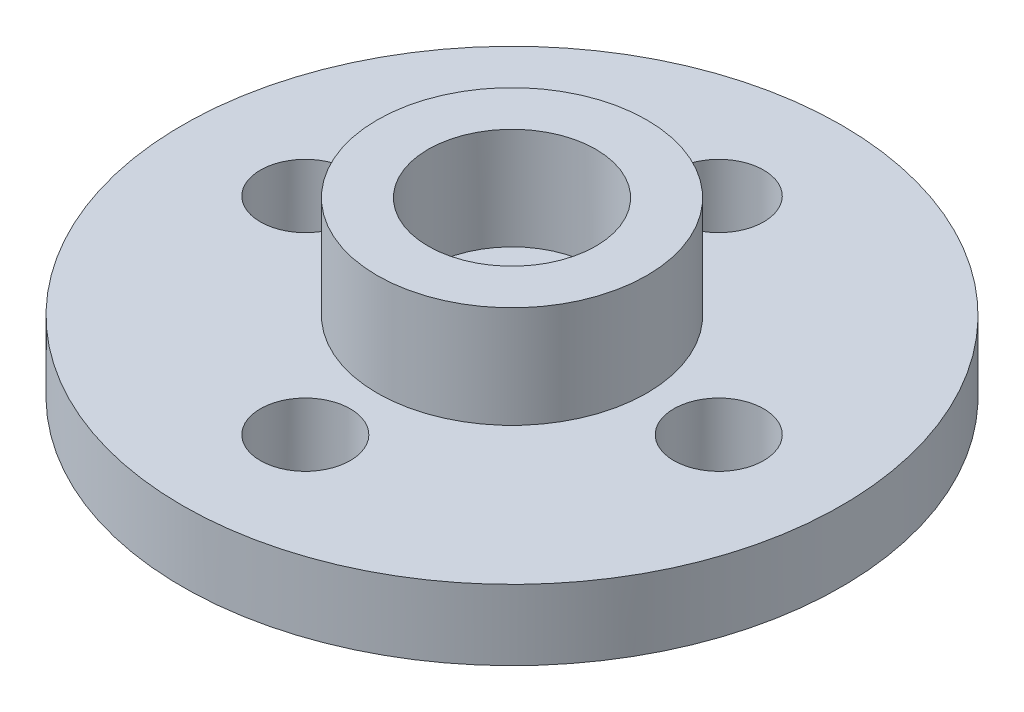
ISO-10303-21;
HEADER;
FILE_DESCRIPTION(('STEP AP214'),'2;1');
FILE_NAME('part.step','',(''),(''),'','','');
FILE_SCHEMA(('AUTOMOTIVE_DESIGN { 1 0 10303 214 1 1 1 1 }'));
ENDSEC;
DATA;
#1=APPLICATION_CONTEXT('core data for automotive mechanical design processes');
#2=APPLICATION_PROTOCOL_DEFINITION('international standard','automotive_design',2000,#1);
#3=PRODUCT_CONTEXT('',#1,'mechanical');
#4=PRODUCT('Part','Part','',(#3));
#5=PRODUCT_RELATED_PRODUCT_CATEGORY('part','',(#4));
#6=PRODUCT_DEFINITION_FORMATION('','',#4);
#7=PRODUCT_DEFINITION_CONTEXT('part definition',#1,'design');
#8=PRODUCT_DEFINITION('design','',#6,#7);
#9=PRODUCT_DEFINITION_SHAPE('','',#8);
#10=(LENGTH_UNIT() NAMED_UNIT(*) SI_UNIT(.MILLI.,.METRE.));
#11=(NAMED_UNIT(*) PLANE_ANGLE_UNIT() SI_UNIT($,.RADIAN.));
#12=(NAMED_UNIT(*) SI_UNIT($,.STERADIAN.) SOLID_ANGLE_UNIT());
#13=UNCERTAINTY_MEASURE_WITH_UNIT(LENGTH_MEASURE(1.E-05),#10,'distance_accuracy_value','');
#14=(GEOMETRIC_REPRESENTATION_CONTEXT(3) GLOBAL_UNCERTAINTY_ASSIGNED_CONTEXT((#13)) GLOBAL_UNIT_ASSIGNED_CONTEXT((#10,
#11,#12)) REPRESENTATION_CONTEXT('',''));
#15=CARTESIAN_POINT('',(0.,0.,0.));
#16=DIRECTION('',(0.,0.,1.));
#17=DIRECTION('',(1.,0.,0.));
#18=AXIS2_PLACEMENT_3D('',#15,#16,#17);
#19=CARTESIAN_POINT('',(0.,5.65,0.));
#20=DIRECTION('',(0.,-1.,0.));
#21=DIRECTION('',(0.,0.,-1.));
#22=AXIS2_PLACEMENT_3D('',#19,#20,#21);
#23=CYLINDRICAL_SURFACE('',#22,11.);
#24=CARTESIAN_POINT('',(0.,1.65,0.));
#25=DIRECTION('',(0.,1.,0.));
#26=DIRECTION('',(0.,0.,1.));
#27=AXIS2_PLACEMENT_3D('',#24,#25,#26);
#28=CIRCLE('',#27,11.);
#29=CARTESIAN_POINT('',(0.,1.65,11.));
#30=VERTEX_POINT('',#29);
#31=EDGE_CURVE('E51',#30,#30,#28,.T.);
#32=ORIENTED_EDGE('',*,*,#31,.F.);
#33=EDGE_LOOP('',(#32));
#34=FACE_BOUND('',#33,.T.);
#35=CARTESIAN_POINT('',(0.,-0.7,0.));
#36=DIRECTION('',(0.,-1.,0.));
#37=DIRECTION('',(0.,0.,-1.));
#38=AXIS2_PLACEMENT_3D('',#35,#36,#37);
#39=CIRCLE('',#38,11.);
#40=CARTESIAN_POINT('',(0.,-0.7,-11.));
#41=VERTEX_POINT('',#40);
#42=EDGE_CURVE('E76',#41,#41,#39,.T.);
#43=ORIENTED_EDGE('',*,*,#42,.F.);
#44=EDGE_LOOP('',(#43));
#45=FACE_BOUND('',#44,.T.);
#46=ADVANCED_FACE('F31',(#34,#45),#23,.T.);
#47=CARTESIAN_POINT('',(0.,-6.35000000000001,6.9));
#48=DIRECTION('',(0.,1.,0.));
#49=DIRECTION('',(0.,0.,1.));
#50=AXIS2_PLACEMENT_3D('',#47,#48,#49);
#51=CYLINDRICAL_SURFACE('',#50,1.5);
#52=CARTESIAN_POINT('',(0.,1.65,6.9));
#53=DIRECTION('',(0.,1.,0.));
#54=DIRECTION('',(0.,0.,1.));
#55=AXIS2_PLACEMENT_3D('',#52,#53,#54);
#56=CIRCLE('',#55,1.5);
#57=CARTESIAN_POINT('',(0.,1.65,8.4));
#58=VERTEX_POINT('',#57);
#59=EDGE_CURVE('E37',#58,#58,#56,.F.);
#60=ORIENTED_EDGE('',*,*,#59,.F.);
#61=EDGE_LOOP('',(#60));
#62=FACE_BOUND('',#61,.T.);
#63=CARTESIAN_POINT('',(0.,-0.7,6.9));
#64=DIRECTION('',(0.,-1.,0.));
#65=DIRECTION('',(0.,0.,-1.));
#66=AXIS2_PLACEMENT_3D('',#63,#64,#65);
#67=CIRCLE('',#66,1.5);
#68=CARTESIAN_POINT('',(0.,-0.7,5.4));
#69=VERTEX_POINT('',#68);
#70=EDGE_CURVE('E84',#69,#69,#67,.T.);
#71=ORIENTED_EDGE('',*,*,#70,.T.);
#72=EDGE_LOOP('',(#71));
#73=FACE_BOUND('',#72,.T.);
#74=ADVANCED_FACE('F114',(#62,#73),#51,.F.);
#75=CARTESIAN_POINT('',(6.9,-6.35000000000001,0.));
#76=DIRECTION('',(0.,1.,0.));
#77=DIRECTION('',(0.,0.,1.));
#78=AXIS2_PLACEMENT_3D('',#75,#76,#77);
#79=CYLINDRICAL_SURFACE('',#78,1.5);
#80=CARTESIAN_POINT('',(6.9,1.65,0.));
#81=DIRECTION('',(0.,1.,0.));
#82=DIRECTION('',(0.,0.,1.));
#83=AXIS2_PLACEMENT_3D('',#80,#81,#82);
#84=CIRCLE('',#83,1.5);
#85=CARTESIAN_POINT('',(6.9,1.65,1.5));
#86=VERTEX_POINT('',#85);
#87=EDGE_CURVE('E41',#86,#86,#84,.F.);
#88=ORIENTED_EDGE('',*,*,#87,.F.);
#89=EDGE_LOOP('',(#88));
#90=FACE_BOUND('',#89,.T.);
#91=CARTESIAN_POINT('',(6.9,-0.7,0.));
#92=DIRECTION('',(0.,-1.,0.));
#93=DIRECTION('',(0.,0.,-1.));
#94=AXIS2_PLACEMENT_3D('',#91,#92,#93);
#95=CIRCLE('',#94,1.5);
#96=CARTESIAN_POINT('',(6.9,-0.7,-1.5));
#97=VERTEX_POINT('',#96);
#98=EDGE_CURVE('E87',#97,#97,#95,.T.);
#99=ORIENTED_EDGE('',*,*,#98,.T.);
#100=EDGE_LOOP('',(#99));
#101=FACE_BOUND('',#100,.T.);
#102=ADVANCED_FACE('F119',(#90,#101),#79,.F.);
#103=CARTESIAN_POINT('',(0.,-6.35000000000001,-6.9));
#104=DIRECTION('',(0.,1.,0.));
#105=DIRECTION('',(0.,0.,1.));
#106=AXIS2_PLACEMENT_3D('',#103,#104,#105);
#107=CYLINDRICAL_SURFACE('',#106,1.5);
#108=CARTESIAN_POINT('',(0.,1.65,-6.9));
#109=DIRECTION('',(0.,1.,0.));
#110=DIRECTION('',(0.,0.,1.));
#111=AXIS2_PLACEMENT_3D('',#108,#109,#110);
#112=CIRCLE('',#111,1.5);
#113=CARTESIAN_POINT('',(0.,1.65,-5.4));
#114=VERTEX_POINT('',#113);
#115=EDGE_CURVE('E46',#114,#114,#112,.F.);
#116=ORIENTED_EDGE('',*,*,#115,.F.);
#117=EDGE_LOOP('',(#116));
#118=FACE_BOUND('',#117,.T.);
#119=CARTESIAN_POINT('',(0.,-0.7,-6.9));
#120=DIRECTION('',(0.,-1.,0.));
#121=DIRECTION('',(0.,0.,-1.));
#122=AXIS2_PLACEMENT_3D('',#119,#120,#121);
#123=CIRCLE('',#122,1.5);
#124=CARTESIAN_POINT('',(0.,-0.7,-8.4));
#125=VERTEX_POINT('',#124);
#126=EDGE_CURVE('E90',#125,#125,#123,.T.);
#127=ORIENTED_EDGE('',*,*,#126,.T.);
#128=EDGE_LOOP('',(#127));
#129=FACE_BOUND('',#128,.T.);
#130=ADVANCED_FACE('F131',(#118,#129),#107,.F.);
#131=CARTESIAN_POINT('',(-6.9,-6.35000000000001,0.));
#132=DIRECTION('',(0.,1.,0.));
#133=DIRECTION('',(0.,0.,1.));
#134=AXIS2_PLACEMENT_3D('',#131,#132,#133);
#135=CYLINDRICAL_SURFACE('',#134,1.5);
#136=CARTESIAN_POINT('',(-6.9,1.65,0.));
#137=DIRECTION('',(0.,1.,0.));
#138=DIRECTION('',(0.,0.,1.));
#139=AXIS2_PLACEMENT_3D('',#136,#137,#138);
#140=CIRCLE('',#139,1.5);
#141=CARTESIAN_POINT('',(-6.9,1.65,1.5));
#142=VERTEX_POINT('',#141);
#143=EDGE_CURVE('E49',#142,#142,#140,.F.);
#144=ORIENTED_EDGE('',*,*,#143,.F.);
#145=EDGE_LOOP('',(#144));
#146=FACE_BOUND('',#145,.T.);
#147=CARTESIAN_POINT('',(-6.9,-0.7,0.));
#148=DIRECTION('',(0.,-1.,0.));
#149=DIRECTION('',(0.,0.,-1.));
#150=AXIS2_PLACEMENT_3D('',#147,#148,#149);
#151=CIRCLE('',#150,1.5);
#152=CARTESIAN_POINT('',(-6.9,-0.7,-1.5));
#153=VERTEX_POINT('',#152);
#154=EDGE_CURVE('E93',#153,#153,#151,.T.);
#155=ORIENTED_EDGE('',*,*,#154,.T.);
#156=EDGE_LOOP('',(#155));
#157=FACE_BOUND('',#156,.T.);
#158=ADVANCED_FACE('F97',(#146,#157),#135,.F.);
#159=CARTESIAN_POINT('',(0.,-6.35000000000001,0.));
#160=DIRECTION('',(0.,1.,0.));
#161=DIRECTION('',(0.,0.,1.));
#162=AXIS2_PLACEMENT_3D('',#159,#160,#161);
#163=CYLINDRICAL_SURFACE('',#162,2.8);
#164=CARTESIAN_POINT('',(0.,1.65,0.));
#165=DIRECTION('',(0.,1.,0.));
#166=DIRECTION('',(0.,0.,1.));
#167=AXIS2_PLACEMENT_3D('',#164,#165,#166);
#168=CIRCLE('',#167,2.8);
#169=CARTESIAN_POINT('',(0.,1.65,2.8));
#170=VERTEX_POINT('',#169);
#171=EDGE_CURVE('E67',#170,#170,#168,.T.);
#172=ORIENTED_EDGE('',*,*,#171,.F.);
#173=EDGE_LOOP('',(#172));
#174=FACE_BOUND('',#173,.T.);
#175=CARTESIAN_POINT('',(0.,5.05,0.));
#176=DIRECTION('',(0.,-1.,0.));
#177=DIRECTION('',(0.,0.,-1.));
#178=AXIS2_PLACEMENT_3D('',#175,#176,#177);
#179=CIRCLE('',#178,2.8);
#180=CARTESIAN_POINT('',(0.,5.05,-2.8));
#181=VERTEX_POINT('',#180);
#182=EDGE_CURVE('E61',#181,#181,#179,.F.);
#183=ORIENTED_EDGE('',*,*,#182,.T.);
#184=EDGE_LOOP('',(#183));
#185=FACE_BOUND('',#184,.T.);
#186=ADVANCED_FACE('F145',(#174,#185),#163,.F.);
#187=CARTESIAN_POINT('',(0.,1.65,0.));
#188=DIRECTION('',(0.,1.,0.));
#189=DIRECTION('',(0.,0.,1.));
#190=AXIS2_PLACEMENT_3D('',#187,#188,#189);
#191=PLANE('',#190);
#192=CARTESIAN_POINT('',(0.,1.65,0.));
#193=DIRECTION('',(0.,1.,0.));
#194=DIRECTION('',(0.,0.,1.));
#195=AXIS2_PLACEMENT_3D('',#192,#193,#194);
#196=CIRCLE('',#195,4.5);
#197=CARTESIAN_POINT('',(0.,1.65,4.5));
#198=VERTEX_POINT('',#197);
#199=EDGE_CURVE('E56',#198,#198,#196,.T.);
#200=ORIENTED_EDGE('',*,*,#199,.F.);
#201=EDGE_LOOP('',(#200));
#202=FACE_BOUND('',#201,.T.);
#203=ORIENTED_EDGE('',*,*,#31,.T.);
#204=EDGE_LOOP('',(#203));
#205=FACE_BOUND('',#204,.T.);
#206=ORIENTED_EDGE('',*,*,#143,.T.);
#207=EDGE_LOOP('',(#206));
#208=FACE_BOUND('',#207,.T.);
#209=ORIENTED_EDGE('',*,*,#115,.T.);
#210=EDGE_LOOP('',(#209));
#211=FACE_BOUND('',#210,.T.);
#212=ORIENTED_EDGE('',*,*,#87,.T.);
#213=EDGE_LOOP('',(#212));
#214=FACE_BOUND('',#213,.T.);
#215=ORIENTED_EDGE('',*,*,#59,.T.);
#216=EDGE_LOOP('',(#215));
#217=FACE_BOUND('',#216,.T.);
#218=ADVANCED_FACE('F141',(#202,#205,#208,#211,#214,#217),#191,.T.);
#219=CARTESIAN_POINT('',(0.,1.65,0.));
#220=DIRECTION('',(0.,1.,0.));
#221=DIRECTION('',(0.,0.,1.));
#222=AXIS2_PLACEMENT_3D('',#219,#220,#221);
#223=CYLINDRICAL_SURFACE('',#222,4.5);
#224=CARTESIAN_POINT('',(0.,5.05,0.));
#225=DIRECTION('',(0.,-1.,0.));
#226=DIRECTION('',(0.,0.,-1.));
#227=AXIS2_PLACEMENT_3D('',#224,#225,#226);
#228=CIRCLE('',#227,4.5);
#229=CARTESIAN_POINT('',(0.,5.05,-4.5));
#230=VERTEX_POINT('',#229);
#231=EDGE_CURVE('E10',#230,#230,#228,.F.);
#232=ORIENTED_EDGE('',*,*,#231,.F.);
#233=EDGE_LOOP('',(#232));
#234=FACE_BOUND('',#233,.T.);
#235=ORIENTED_EDGE('',*,*,#199,.T.);
#236=EDGE_LOOP('',(#235));
#237=FACE_BOUND('',#236,.T.);
#238=ADVANCED_FACE('F152',(#234,#237),#223,.T.);
#239=CARTESIAN_POINT('',(-8.,5.05,4.5));
#240=DIRECTION('',(0.,-1.,0.));
#241=DIRECTION('',(0.,0.,-1.));
#242=AXIS2_PLACEMENT_3D('',#239,#240,#241);
#243=PLANE('',#242);
#244=ORIENTED_EDGE('',*,*,#231,.T.);
#245=EDGE_LOOP('',(#244));
#246=FACE_BOUND('',#245,.T.);
#247=ORIENTED_EDGE('',*,*,#182,.F.);
#248=EDGE_LOOP('',(#247));
#249=FACE_BOUND('',#248,.T.);
#250=ADVANCED_FACE('F158',(#246,#249),#243,.F.);
#251=CARTESIAN_POINT('',(0.,-0.650000000000003,0.));
#252=DIRECTION('',(0.,1.,0.));
#253=DIRECTION('',(0.,0.,1.));
#254=AXIS2_PLACEMENT_3D('',#251,#252,#253);
#255=PLANE('',#254);
#256=CARTESIAN_POINT('',(0.,-0.650000000000003,0.));
#257=DIRECTION('',(0.,1.,0.));
#258=DIRECTION('',(0.,0.,1.));
#259=AXIS2_PLACEMENT_3D('',#256,#257,#258);
#260=CIRCLE('',#259,1.5);
#261=CARTESIAN_POINT('',(0.,-0.650000000000003,1.5));
#262=VERTEX_POINT('',#261);
#263=EDGE_CURVE('E70',#262,#262,#260,.T.);
#264=ORIENTED_EDGE('',*,*,#263,.T.);
#265=EDGE_LOOP('',(#264));
#266=FACE_BOUND('',#265,.T.);
#267=CARTESIAN_POINT('',(0.,-0.650000000000003,0.));
#268=DIRECTION('',(0.,1.,0.));
#269=DIRECTION('',(0.,0.,1.));
#270=AXIS2_PLACEMENT_3D('',#267,#268,#269);
#271=CIRCLE('',#270,2.8);
#272=CARTESIAN_POINT('',(0.,-0.650000000000003,2.8));
#273=VERTEX_POINT('',#272);
#274=EDGE_CURVE('E66',#273,#273,#271,.T.);
#275=ORIENTED_EDGE('',*,*,#274,.F.);
#276=EDGE_LOOP('',(#275));
#277=FACE_BOUND('',#276,.T.);
#278=ADVANCED_FACE('F160',(#266,#277),#255,.F.);
#279=CARTESIAN_POINT('',(0.,1.65,0.));
#280=DIRECTION('',(0.,1.,0.));
#281=DIRECTION('',(0.,0.,1.));
#282=AXIS2_PLACEMENT_3D('',#279,#280,#281);
#283=PLANE('',#282);
#284=CARTESIAN_POINT('',(0.,1.65,0.));
#285=DIRECTION('',(0.,1.,0.));
#286=DIRECTION('',(0.,0.,1.));
#287=AXIS2_PLACEMENT_3D('',#284,#285,#286);
#288=CIRCLE('',#287,1.5);
#289=CARTESIAN_POINT('',(0.,1.65,1.5));
#290=VERTEX_POINT('',#289);
#291=EDGE_CURVE('E73',#290,#290,#288,.T.);
#292=ORIENTED_EDGE('',*,*,#291,.F.);
#293=EDGE_LOOP('',(#292));
#294=FACE_BOUND('',#293,.T.);
#295=ORIENTED_EDGE('',*,*,#171,.T.);
#296=EDGE_LOOP('',(#295));
#297=FACE_BOUND('',#296,.T.);
#298=ADVANCED_FACE('F166',(#294,#297),#283,.T.);
#299=CARTESIAN_POINT('',(0.,-0.650000000000003,0.));
#300=DIRECTION('',(0.,1.,0.));
#301=DIRECTION('',(0.,0.,1.));
#302=AXIS2_PLACEMENT_3D('',#299,#300,#301);
#303=CYLINDRICAL_SURFACE('',#302,1.5);
#304=ORIENTED_EDGE('',*,*,#263,.F.);
#305=EDGE_LOOP('',(#304));
#306=FACE_BOUND('',#305,.T.);
#307=ORIENTED_EDGE('',*,*,#291,.T.);
#308=EDGE_LOOP('',(#307));
#309=FACE_BOUND('',#308,.T.);
#310=ADVANCED_FACE('F107',(#306,#309),#303,.F.);
#311=CARTESIAN_POINT('',(0.,-0.7,0.));
#312=DIRECTION('',(0.,1.,0.));
#313=DIRECTION('',(0.,0.,1.));
#314=AXIS2_PLACEMENT_3D('',#311,#312,#313);
#315=CYLINDRICAL_SURFACE('',#314,2.8);
#316=CARTESIAN_POINT('',(0.,-0.7,0.));
#317=DIRECTION('',(0.,-1.,0.));
#318=DIRECTION('',(0.,0.,-1.));
#319=AXIS2_PLACEMENT_3D('',#316,#317,#318);
#320=CIRCLE('',#319,2.8);
#321=CARTESIAN_POINT('',(0.,-0.7,-2.8));
#322=VERTEX_POINT('',#321);
#323=EDGE_CURVE('E81',#322,#322,#320,.T.);
#324=ORIENTED_EDGE('',*,*,#323,.T.);
#325=EDGE_LOOP('',(#324));
#326=FACE_BOUND('',#325,.T.);
#327=ORIENTED_EDGE('',*,*,#274,.T.);
#328=EDGE_LOOP('',(#327));
#329=FACE_BOUND('',#328,.T.);
#330=ADVANCED_FACE('F101',(#326,#329),#315,.F.);
#331=CARTESIAN_POINT('',(0.,-0.7,0.));
#332=DIRECTION('',(0.,-1.,0.));
#333=DIRECTION('',(0.,0.,-1.));
#334=AXIS2_PLACEMENT_3D('',#331,#332,#333);
#335=PLANE('',#334);
#336=ORIENTED_EDGE('',*,*,#126,.F.);
#337=EDGE_LOOP('',(#336));
#338=FACE_BOUND('',#337,.T.);
#339=ORIENTED_EDGE('',*,*,#70,.F.);
#340=EDGE_LOOP('',(#339));
#341=FACE_BOUND('',#340,.T.);
#342=ORIENTED_EDGE('',*,*,#42,.T.);
#343=EDGE_LOOP('',(#342));
#344=FACE_BOUND('',#343,.T.);
#345=ORIENTED_EDGE('',*,*,#323,.F.);
#346=EDGE_LOOP('',(#345));
#347=FACE_BOUND('',#346,.T.);
#348=ORIENTED_EDGE('',*,*,#98,.F.);
#349=EDGE_LOOP('',(#348));
#350=FACE_BOUND('',#349,.T.);
#351=ORIENTED_EDGE('',*,*,#154,.F.);
#352=EDGE_LOOP('',(#351));
#353=FACE_BOUND('',#352,.T.);
#354=ADVANCED_FACE('F99',(#338,#341,#344,#347,#350,#353),#335,.T.);
#355=CLOSED_SHELL('',(#46,#74,#102,#130,#158,#186,#218,#238,#250,#278,#298,#310,#330,#354));
#356=MANIFOLD_SOLID_BREP('B2',#355);
#357=ADVANCED_BREP_SHAPE_REPRESENTATION('',(#18,#356),#14);
#358=SHAPE_DEFINITION_REPRESENTATION(#9,#357);
ENDSEC;
END-ISO-10303-21;
